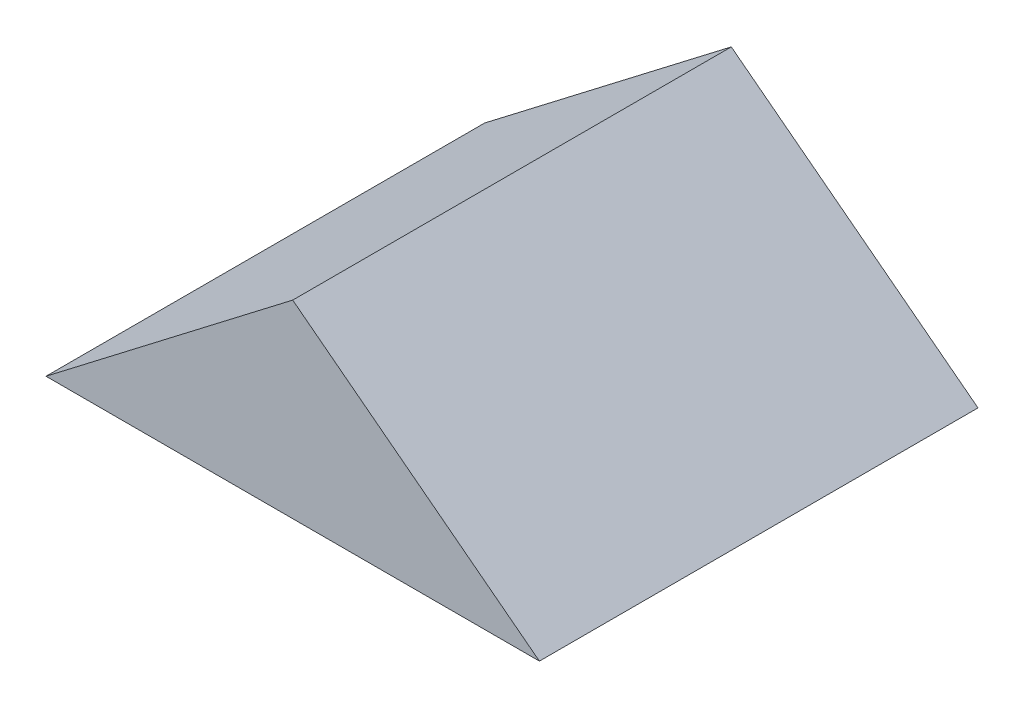
ISO-10303-21;
HEADER;
FILE_DESCRIPTION(('STEP AP214'),'2;1');
FILE_NAME('part.step','',(''),(''),'','','');
FILE_SCHEMA(('AUTOMOTIVE_DESIGN { 1 0 10303 214 1 1 1 1 }'));
ENDSEC;
DATA;
#1=APPLICATION_CONTEXT('core data for automotive mechanical design processes');
#2=APPLICATION_PROTOCOL_DEFINITION('international standard','automotive_design',2000,#1);
#3=PRODUCT_CONTEXT('',#1,'mechanical');
#4=PRODUCT('Part','Part','',(#3));
#5=PRODUCT_RELATED_PRODUCT_CATEGORY('part','',(#4));
#6=PRODUCT_DEFINITION_FORMATION('','',#4);
#7=PRODUCT_DEFINITION_CONTEXT('part definition',#1,'design');
#8=PRODUCT_DEFINITION('design','',#6,#7);
#9=PRODUCT_DEFINITION_SHAPE('','',#8);
#10=(LENGTH_UNIT() NAMED_UNIT(*) SI_UNIT(.MILLI.,.METRE.));
#11=(NAMED_UNIT(*) PLANE_ANGLE_UNIT() SI_UNIT($,.RADIAN.));
#12=(NAMED_UNIT(*) SI_UNIT($,.STERADIAN.) SOLID_ANGLE_UNIT());
#13=UNCERTAINTY_MEASURE_WITH_UNIT(LENGTH_MEASURE(1.E-05),#10,'distance_accuracy_value','');
#14=(GEOMETRIC_REPRESENTATION_CONTEXT(3) GLOBAL_UNCERTAINTY_ASSIGNED_CONTEXT((#13)) GLOBAL_UNIT_ASSIGNED_CONTEXT((#10,
#11,#12)) REPRESENTATION_CONTEXT('',''));
#15=CARTESIAN_POINT('',(0.,0.,0.));
#16=DIRECTION('',(0.,0.,1.));
#17=DIRECTION('',(1.,0.,0.));
#18=AXIS2_PLACEMENT_3D('',#15,#16,#17);
#19=CARTESIAN_POINT('',(0.,-2.67326987978964,0.));
#20=DIRECTION('',(0.,-1.,0.));
#21=DIRECTION('',(1.,0.,0.));
#22=AXIS2_PLACEMENT_3D('',#19,#20,#21);
#23=PLANE('',#22);
#24=DIRECTION('',(-1.,0.,0.));
#25=VECTOR('',#24,1.);
#26=CARTESIAN_POINT('',(80.,-2.67326987978962,150.));
#27=LINE('',#26,#25);
#28=CARTESIAN_POINT('',(80.,-2.67326987978962,150.));
#29=VERTEX_POINT('',#28);
#30=CARTESIAN_POINT('',(71.1637758980097,-2.67326987978962,150.));
#31=VERTEX_POINT('',#30);
#32=EDGE_CURVE('E171',#29,#31,#27,.T.);
#33=ORIENTED_EDGE('',*,*,#32,.T.);
#34=DIRECTION('',(0.,0.,1.));
#35=VECTOR('',#34,1.);
#36=CARTESIAN_POINT('',(71.1637758980097,-2.67326987978962,160.));
#37=LINE('',#36,#35);
#38=CARTESIAN_POINT('',(71.1637758980097,-2.67326987978962,10.));
#39=VERTEX_POINT('',#38);
#40=EDGE_CURVE('E11',#31,#39,#37,.F.);
#41=ORIENTED_EDGE('',*,*,#40,.T.);
#42=DIRECTION('',(1.,0.,0.));
#43=VECTOR('',#42,1.);
#44=CARTESIAN_POINT('',(-80.,-2.67326987978965,10.));
#45=LINE('',#44,#43);
#46=CARTESIAN_POINT('',(80.,-2.67326987978962,10.));
#47=VERTEX_POINT('',#46);
#48=EDGE_CURVE('E161',#39,#47,#45,.T.);
#49=ORIENTED_EDGE('',*,*,#48,.T.);
#50=DIRECTION('',(0.,0.,1.));
#51=VECTOR('',#50,1.);
#52=CARTESIAN_POINT('',(80.,-2.67326987978962,10.));
#53=LINE('',#52,#51);
#54=EDGE_CURVE('E166',#47,#29,#53,.T.);
#55=ORIENTED_EDGE('',*,*,#54,.T.);
#56=EDGE_LOOP('',(#33,#41,#49,#55));
#57=FACE_BOUND('',#56,.T.);
#58=ADVANCED_FACE('F33',(#57),#23,.T.);
#59=CARTESIAN_POINT('',(-80.,-2.67326987978965,10.));
#60=VERTEX_POINT('',#59);
#61=CARTESIAN_POINT('',(-71.1637758980097,-2.67326987978965,10.));
#62=VERTEX_POINT('',#61);
#63=EDGE_CURVE('E163',#60,#62,#45,.T.);
#64=ORIENTED_EDGE('',*,*,#63,.T.);
#65=DIRECTION('',(0.,0.,-1.));
#66=VECTOR('',#65,1.);
#67=CARTESIAN_POINT('',(-71.1637758980097,-2.67326987978965,160.));
#68=LINE('',#67,#66);
#69=CARTESIAN_POINT('',(-71.1637758980097,-2.67326987978965,150.));
#70=VERTEX_POINT('',#69);
#71=EDGE_CURVE('E42',#62,#70,#68,.F.);
#72=ORIENTED_EDGE('',*,*,#71,.T.);
#73=CARTESIAN_POINT('',(-80.,-2.67326987978965,150.));
#74=VERTEX_POINT('',#73);
#75=EDGE_CURVE('E170',#70,#74,#27,.T.);
#76=ORIENTED_EDGE('',*,*,#75,.T.);
#77=DIRECTION('',(0.,0.,-1.));
#78=VECTOR('',#77,1.);
#79=CARTESIAN_POINT('',(-80.,-2.67326987978965,150.));
#80=LINE('',#79,#78);
#81=EDGE_CURVE('E158',#74,#60,#80,.T.);
#82=ORIENTED_EDGE('',*,*,#81,.T.);
#83=EDGE_LOOP('',(#64,#72,#76,#82));
#84=FACE_BOUND('',#83,.T.);
#85=ADVANCED_FACE('F238',(#84),#23,.T.);
#86=CARTESIAN_POINT('',(80.,0.,160.));
#87=DIRECTION('',(-0.608761429008722,-0.793353340291234,0.));
#88=DIRECTION('',(0.793353340291234,-0.608761429008722,0.));
#89=AXIS2_PLACEMENT_3D('',#86,#87,#88);
#90=PLANE('',#89);
#91=DIRECTION('',(-0.793353340291234,0.608761429008722,0.));
#92=VECTOR('',#91,1.);
#93=CARTESIAN_POINT('',(80.,0.,0.));
#94=LINE('',#93,#92);
#95=CARTESIAN_POINT('',(90.,-7.67326987978962,0.));
#96=VERTEX_POINT('',#95);
#97=CARTESIAN_POINT('',(0.,61.3861590383171,0.));
#98=VERTEX_POINT('',#97);
#99=EDGE_CURVE('E197',#96,#98,#94,.T.);
#100=ORIENTED_EDGE('',*,*,#99,.T.);
#101=DIRECTION('',(0.,0.,-1.));
#102=VECTOR('',#101,1.);
#103=CARTESIAN_POINT('',(0.,61.3861590383171,160.));
#104=LINE('',#103,#102);
#105=CARTESIAN_POINT('',(0.,61.3861590383171,160.));
#106=VERTEX_POINT('',#105);
#107=EDGE_CURVE('E207',#106,#98,#104,.T.);
#108=ORIENTED_EDGE('',*,*,#107,.F.);
#109=DIRECTION('',(0.793353340291234,-0.608761429008723,0.));
#110=VECTOR('',#109,1.);
#111=CARTESIAN_POINT('',(80.,0.,160.));
#112=LINE('',#111,#110);
#113=CARTESIAN_POINT('',(90.,-7.67326987978962,160.));
#114=VERTEX_POINT('',#113);
#115=EDGE_CURVE('E193',#106,#114,#112,.T.);
#116=ORIENTED_EDGE('',*,*,#115,.T.);
#117=DIRECTION('',(0.,0.,-1.));
#118=VECTOR('',#117,1.);
#119=CARTESIAN_POINT('',(90.,-7.67326987978962,160.));
#120=LINE('',#119,#118);
#121=EDGE_CURVE('E37',#114,#96,#120,.T.);
#122=ORIENTED_EDGE('',*,*,#121,.T.);
#123=EDGE_LOOP('',(#100,#108,#116,#122));
#124=FACE_BOUND('',#123,.T.);
#125=ADVANCED_FACE('F215',(#124),#90,.F.);
#126=CARTESIAN_POINT('',(0.,61.3861590383171,160.));
#127=DIRECTION('',(0.608761429008723,-0.793353340291234,0.));
#128=DIRECTION('',(0.793353340291234,0.608761429008723,0.));
#129=AXIS2_PLACEMENT_3D('',#126,#127,#128);
#130=PLANE('',#129);
#131=DIRECTION('',(-0.793353340291234,-0.608761429008722,0.));
#132=VECTOR('',#131,1.);
#133=CARTESIAN_POINT('',(0.,61.3861590383171,0.));
#134=LINE('',#133,#132);
#135=CARTESIAN_POINT('',(-90.,-7.67326987978965,0.));
#136=VERTEX_POINT('',#135);
#137=EDGE_CURVE('E204',#98,#136,#134,.T.);
#138=ORIENTED_EDGE('',*,*,#137,.T.);
#139=DIRECTION('',(0.,0.,-1.));
#140=VECTOR('',#139,1.);
#141=CARTESIAN_POINT('',(-90.,-7.67326987978965,160.));
#142=LINE('',#141,#140);
#143=CARTESIAN_POINT('',(-90.,-7.67326987978965,160.));
#144=VERTEX_POINT('',#143);
#145=EDGE_CURVE('E209',#144,#136,#142,.T.);
#146=ORIENTED_EDGE('',*,*,#145,.F.);
#147=DIRECTION('',(0.793353340291234,0.608761429008723,0.));
#148=VECTOR('',#147,1.);
#149=CARTESIAN_POINT('',(-90.,-7.67326987978965,160.));
#150=LINE('',#149,#148);
#151=EDGE_CURVE('E200',#144,#106,#150,.T.);
#152=ORIENTED_EDGE('',*,*,#151,.T.);
#153=ORIENTED_EDGE('',*,*,#107,.T.);
#154=EDGE_LOOP('',(#138,#146,#152,#153));
#155=FACE_BOUND('',#154,.T.);
#156=ADVANCED_FACE('F223',(#155),#130,.F.);
#157=CARTESIAN_POINT('',(90.,-7.67326987978962,160.));
#158=DIRECTION('',(0.,-1.,0.));
#159=DIRECTION('',(1.,0.,0.));
#160=AXIS2_PLACEMENT_3D('',#157,#158,#159);
#161=PLANE('',#160);
#162=DIRECTION('',(0.,0.,-1.));
#163=VECTOR('',#162,1.);
#164=CARTESIAN_POINT('',(-80.,-7.67326987978965,150.));
#165=LINE('',#164,#163);
#166=CARTESIAN_POINT('',(-80.,-7.67326987978965,150.));
#167=VERTEX_POINT('',#166);
#168=CARTESIAN_POINT('',(-80.,-7.67326987978965,10.));
#169=VERTEX_POINT('',#168);
#170=EDGE_CURVE('E60',#167,#169,#165,.T.);
#171=ORIENTED_EDGE('',*,*,#170,.F.);
#172=DIRECTION('',(-1.,0.,0.));
#173=VECTOR('',#172,1.);
#174=CARTESIAN_POINT('',(80.,-7.67326987978962,150.));
#175=LINE('',#174,#173);
#176=CARTESIAN_POINT('',(80.,-7.67326987978962,150.));
#177=VERTEX_POINT('',#176);
#178=EDGE_CURVE('E162',#177,#167,#175,.T.);
#179=ORIENTED_EDGE('',*,*,#178,.F.);
#180=DIRECTION('',(0.,0.,1.));
#181=VECTOR('',#180,1.);
#182=CARTESIAN_POINT('',(80.,-7.67326987978962,10.));
#183=LINE('',#182,#181);
#184=CARTESIAN_POINT('',(80.,-7.67326987978962,10.));
#185=VERTEX_POINT('',#184);
#186=EDGE_CURVE('E180',#185,#177,#183,.T.);
#187=ORIENTED_EDGE('',*,*,#186,.F.);
#188=DIRECTION('',(1.,0.,0.));
#189=VECTOR('',#188,1.);
#190=CARTESIAN_POINT('',(-80.,-7.67326987978965,10.));
#191=LINE('',#190,#189);
#192=EDGE_CURVE('E177',#169,#185,#191,.T.);
#193=ORIENTED_EDGE('',*,*,#192,.F.);
#194=EDGE_LOOP('',(#171,#179,#187,#193));
#195=FACE_BOUND('',#194,.T.);
#196=DIRECTION('',(-1.,0.,0.));
#197=VECTOR('',#196,1.);
#198=CARTESIAN_POINT('',(90.,-7.67326987978962,0.));
#199=LINE('',#198,#197);
#200=EDGE_CURVE('E187',#96,#136,#199,.T.);
#201=ORIENTED_EDGE('',*,*,#200,.F.);
#202=ORIENTED_EDGE('',*,*,#121,.F.);
#203=DIRECTION('',(-1.,0.,0.));
#204=VECTOR('',#203,1.);
#205=CARTESIAN_POINT('',(90.,-7.67326987978962,160.));
#206=LINE('',#205,#204);
#207=EDGE_CURVE('E196',#114,#144,#206,.T.);
#208=ORIENTED_EDGE('',*,*,#207,.T.);
#209=ORIENTED_EDGE('',*,*,#145,.T.);
#210=EDGE_LOOP('',(#201,#202,#208,#209));
#211=FACE_BOUND('',#210,.T.);
#212=ADVANCED_FACE('F35',(#195,#211),#161,.T.);
#213=CARTESIAN_POINT('',(0.,0.,160.));
#214=DIRECTION('',(0.,0.,1.));
#215=DIRECTION('',(1.,0.,0.));
#216=AXIS2_PLACEMENT_3D('',#213,#214,#215);
#217=PLANE('',#216);
#218=ORIENTED_EDGE('',*,*,#115,.F.);
#219=ORIENTED_EDGE('',*,*,#151,.F.);
#220=ORIENTED_EDGE('',*,*,#207,.F.);
#221=EDGE_LOOP('',(#218,#219,#220));
#222=FACE_BOUND('',#221,.T.);
#223=ADVANCED_FACE('F226',(#222),#217,.T.);
#224=CARTESIAN_POINT('',(0.,0.,0.));
#225=DIRECTION('',(0.,0.,1.));
#226=DIRECTION('',(1.,0.,0.));
#227=AXIS2_PLACEMENT_3D('',#224,#225,#226);
#228=PLANE('',#227);
#229=ORIENTED_EDGE('',*,*,#99,.F.);
#230=ORIENTED_EDGE('',*,*,#200,.T.);
#231=ORIENTED_EDGE('',*,*,#137,.F.);
#232=EDGE_LOOP('',(#229,#230,#231));
#233=FACE_BOUND('',#232,.T.);
#234=ADVANCED_FACE('F221',(#233),#228,.F.);
#235=CARTESIAN_POINT('',(-80.,-2.67326987978965,150.));
#236=DIRECTION('',(-1.,0.,0.));
#237=DIRECTION('',(0.,-1.,0.));
#238=AXIS2_PLACEMENT_3D('',#235,#236,#237);
#239=PLANE('',#238);
#240=ORIENTED_EDGE('',*,*,#170,.T.);
#241=DIRECTION('',(0.,-1.,0.));
#242=VECTOR('',#241,1.);
#243=CARTESIAN_POINT('',(-80.,-2.67326987978965,10.));
#244=LINE('',#243,#242);
#245=EDGE_CURVE('E174',#60,#169,#244,.T.);
#246=ORIENTED_EDGE('',*,*,#245,.F.);
#247=ORIENTED_EDGE('',*,*,#81,.F.);
#248=DIRECTION('',(0.,-1.,0.));
#249=VECTOR('',#248,1.);
#250=CARTESIAN_POINT('',(-80.,-2.67326987978965,150.));
#251=LINE('',#250,#249);
#252=EDGE_CURVE('E185',#74,#167,#251,.T.);
#253=ORIENTED_EDGE('',*,*,#252,.T.);
#254=EDGE_LOOP('',(#240,#246,#247,#253));
#255=FACE_BOUND('',#254,.T.);
#256=ADVANCED_FACE('F233',(#255),#239,.F.);
#257=CARTESIAN_POINT('',(80.,-2.67326987978962,150.));
#258=DIRECTION('',(0.,0.,1.));
#259=DIRECTION('',(1.,0.,0.));
#260=AXIS2_PLACEMENT_3D('',#257,#258,#259);
#261=PLANE('',#260);
#262=ORIENTED_EDGE('',*,*,#178,.T.);
#263=ORIENTED_EDGE('',*,*,#252,.F.);
#264=ORIENTED_EDGE('',*,*,#75,.F.);
#265=EDGE_CURVE('E175',#31,#70,#27,.T.);
#266=ORIENTED_EDGE('',*,*,#265,.F.);
#267=ORIENTED_EDGE('',*,*,#32,.F.);
#268=DIRECTION('',(0.,-1.,0.));
#269=VECTOR('',#268,1.);
#270=CARTESIAN_POINT('',(80.,-2.67326987978962,150.));
#271=LINE('',#270,#269);
#272=EDGE_CURVE('E188',#29,#177,#271,.T.);
#273=ORIENTED_EDGE('',*,*,#272,.T.);
#274=EDGE_LOOP('',(#262,#263,#264,#266,#267,#273));
#275=FACE_BOUND('',#274,.T.);
#276=ADVANCED_FACE('F248',(#275),#261,.F.);
#277=CARTESIAN_POINT('',(80.,-2.67326987978962,10.));
#278=DIRECTION('',(1.,0.,0.));
#279=DIRECTION('',(0.,1.,0.));
#280=AXIS2_PLACEMENT_3D('',#277,#278,#279);
#281=PLANE('',#280);
#282=ORIENTED_EDGE('',*,*,#186,.T.);
#283=ORIENTED_EDGE('',*,*,#272,.F.);
#284=ORIENTED_EDGE('',*,*,#54,.F.);
#285=DIRECTION('',(0.,-1.,0.));
#286=VECTOR('',#285,1.);
#287=CARTESIAN_POINT('',(80.,-2.67326987978962,10.));
#288=LINE('',#287,#286);
#289=EDGE_CURVE('E190',#47,#185,#288,.T.);
#290=ORIENTED_EDGE('',*,*,#289,.T.);
#291=EDGE_LOOP('',(#282,#283,#284,#290));
#292=FACE_BOUND('',#291,.T.);
#293=ADVANCED_FACE('F251',(#292),#281,.F.);
#294=CARTESIAN_POINT('',(-80.,-2.67326987978965,10.));
#295=DIRECTION('',(0.,0.,-1.));
#296=DIRECTION('',(-1.,0.,0.));
#297=AXIS2_PLACEMENT_3D('',#294,#295,#296);
#298=PLANE('',#297);
#299=ORIENTED_EDGE('',*,*,#192,.T.);
#300=ORIENTED_EDGE('',*,*,#289,.F.);
#301=ORIENTED_EDGE('',*,*,#48,.F.);
#302=EDGE_CURVE('E167',#62,#39,#45,.T.);
#303=ORIENTED_EDGE('',*,*,#302,.F.);
#304=ORIENTED_EDGE('',*,*,#63,.F.);
#305=ORIENTED_EDGE('',*,*,#245,.T.);
#306=EDGE_LOOP('',(#299,#300,#301,#303,#304,#305));
#307=FACE_BOUND('',#306,.T.);
#308=ADVANCED_FACE('F255',(#307),#298,.F.);
#309=CARTESIAN_POINT('',(0.,-2.67326987978964,0.));
#310=DIRECTION('',(0.,-1.,0.));
#311=DIRECTION('',(1.,0.,0.));
#312=AXIS2_PLACEMENT_3D('',#309,#310,#311);
#313=PLANE('',#312);
#314=ORIENTED_EDGE('',*,*,#302,.T.);
#315=CARTESIAN_POINT('',(71.1637758980097,-2.67326987978962,7.50000000000001));
#316=VERTEX_POINT('',#315);
#317=EDGE_CURVE('E45',#39,#316,#37,.F.);
#318=ORIENTED_EDGE('',*,*,#317,.T.);
#319=DIRECTION('',(1.,0.,0.));
#320=VECTOR('',#319,1.);
#321=CARTESIAN_POINT('',(0.,-2.67326987978964,7.5));
#322=LINE('',#321,#320);
#323=CARTESIAN_POINT('',(-71.1637758980097,-2.67326987978965,7.5));
#324=VERTEX_POINT('',#323);
#325=EDGE_CURVE('E133',#316,#324,#322,.F.);
#326=ORIENTED_EDGE('',*,*,#325,.T.);
#327=EDGE_CURVE('E147',#324,#62,#68,.F.);
#328=ORIENTED_EDGE('',*,*,#327,.T.);
#329=EDGE_LOOP('',(#314,#318,#326,#328));
#330=FACE_BOUND('',#329,.T.);
#331=ADVANCED_FACE('F258',(#330),#313,.F.);
#332=CARTESIAN_POINT('',(75.4342892824346,-5.95015005218423,160.));
#333=DIRECTION('',(-0.608761429008722,-0.793353340291234,0.));
#334=DIRECTION('',(0.793353340291234,-0.608761429008722,0.));
#335=AXIS2_PLACEMENT_3D('',#332,#333,#334);
#336=PLANE('',#335);
#337=DIRECTION('',(-0.793353340291234,0.608761429008722,0.));
#338=VECTOR('',#337,1.);
#339=CARTESIAN_POINT('',(75.4342892824346,-5.95015005218423,7.50000000000001));
#340=LINE('',#339,#338);
#341=CARTESIAN_POINT('',(0.,51.9326159332401,7.5));
#342=VERTEX_POINT('',#341);
#343=EDGE_CURVE('E126',#316,#342,#340,.T.);
#344=ORIENTED_EDGE('',*,*,#343,.F.);
#345=ORIENTED_EDGE('',*,*,#317,.F.);
#346=ORIENTED_EDGE('',*,*,#40,.F.);
#347=CARTESIAN_POINT('',(71.1637758980097,-2.67326987978962,152.5));
#348=VERTEX_POINT('',#347);
#349=EDGE_CURVE('E44',#348,#31,#37,.F.);
#350=ORIENTED_EDGE('',*,*,#349,.F.);
#351=DIRECTION('',(0.793353340291234,-0.608761429008722,0.));
#352=VECTOR('',#351,1.);
#353=CARTESIAN_POINT('',(25.0815274783339,32.6868829993785,152.5));
#354=LINE('',#353,#352);
#355=CARTESIAN_POINT('',(0.,51.9326159332401,152.5));
#356=VERTEX_POINT('',#355);
#357=EDGE_CURVE('E136',#356,#348,#354,.T.);
#358=ORIENTED_EDGE('',*,*,#357,.F.);
#359=DIRECTION('',(0.,0.,-1.));
#360=VECTOR('',#359,1.);
#361=CARTESIAN_POINT('',(0.,51.9326159332401,160.));
#362=LINE('',#361,#360);
#363=EDGE_CURVE('E140',#356,#342,#362,.T.);
#364=ORIENTED_EDGE('',*,*,#363,.T.);
#365=EDGE_LOOP('',(#344,#345,#346,#350,#358,#364));
#366=FACE_BOUND('',#365,.T.);
#367=ADVANCED_FACE('F141',(#366),#336,.T.);
#368=CARTESIAN_POINT('',(4.56571071756542,55.4360089861329,160.));
#369=DIRECTION('',(0.608761429008723,-0.793353340291234,0.));
#370=DIRECTION('',(0.793353340291234,0.608761429008723,0.));
#371=AXIS2_PLACEMENT_3D('',#368,#369,#370);
#372=PLANE('',#371);
#373=DIRECTION('',(-0.793353340291234,-0.608761429008723,0.));
#374=VECTOR('',#373,1.);
#375=CARTESIAN_POINT('',(4.56571071756542,55.4360089861329,7.50000000000001));
#376=LINE('',#375,#374);
#377=EDGE_CURVE('E130',#342,#324,#376,.T.);
#378=ORIENTED_EDGE('',*,*,#377,.F.);
#379=ORIENTED_EDGE('',*,*,#363,.F.);
#380=DIRECTION('',(0.793353340291234,0.608761429008723,0.));
#381=VECTOR('',#380,1.);
#382=CARTESIAN_POINT('',(-25.0815274783339,32.6868829993785,152.5));
#383=LINE('',#382,#381);
#384=CARTESIAN_POINT('',(-71.1637758980097,-2.67326987978965,152.5));
#385=VERTEX_POINT('',#384);
#386=EDGE_CURVE('E143',#385,#356,#383,.T.);
#387=ORIENTED_EDGE('',*,*,#386,.F.);
#388=EDGE_CURVE('E52',#70,#385,#68,.F.);
#389=ORIENTED_EDGE('',*,*,#388,.F.);
#390=ORIENTED_EDGE('',*,*,#71,.F.);
#391=ORIENTED_EDGE('',*,*,#327,.F.);
#392=EDGE_LOOP('',(#378,#379,#387,#389,#390,#391));
#393=FACE_BOUND('',#392,.T.);
#394=ADVANCED_FACE('F145',(#393),#372,.T.);
#395=CARTESIAN_POINT('',(0.,0.,152.5));
#396=DIRECTION('',(0.,0.,1.));
#397=DIRECTION('',(1.,0.,0.));
#398=AXIS2_PLACEMENT_3D('',#395,#396,#397);
#399=PLANE('',#398);
#400=ORIENTED_EDGE('',*,*,#357,.T.);
#401=DIRECTION('',(1.,0.,0.));
#402=VECTOR('',#401,1.);
#403=CARTESIAN_POINT('',(0.,-2.67326987978964,152.5));
#404=LINE('',#403,#402);
#405=EDGE_CURVE('E154',#385,#348,#404,.T.);
#406=ORIENTED_EDGE('',*,*,#405,.F.);
#407=ORIENTED_EDGE('',*,*,#386,.T.);
#408=EDGE_LOOP('',(#400,#406,#407));
#409=FACE_BOUND('',#408,.T.);
#410=ADVANCED_FACE('F299',(#409),#399,.F.);
#411=CARTESIAN_POINT('',(0.,0.,7.5));
#412=DIRECTION('',(0.,0.,1.));
#413=DIRECTION('',(1.,0.,0.));
#414=AXIS2_PLACEMENT_3D('',#411,#412,#413);
#415=PLANE('',#414);
#416=ORIENTED_EDGE('',*,*,#343,.T.);
#417=ORIENTED_EDGE('',*,*,#377,.T.);
#418=ORIENTED_EDGE('',*,*,#325,.F.);
#419=EDGE_LOOP('',(#416,#417,#418));
#420=FACE_BOUND('',#419,.T.);
#421=ADVANCED_FACE('F128',(#420),#415,.T.);
#422=ORIENTED_EDGE('',*,*,#265,.T.);
#423=ORIENTED_EDGE('',*,*,#388,.T.);
#424=ORIENTED_EDGE('',*,*,#405,.T.);
#425=ORIENTED_EDGE('',*,*,#349,.T.);
#426=EDGE_LOOP('',(#422,#423,#424,#425));
#427=FACE_BOUND('',#426,.T.);
#428=ADVANCED_FACE('F287',(#427),#313,.F.);
#429=CLOSED_SHELL('',(#58,#85,#125,#156,#212,#223,#234,#256,#276,#293,#308,#331,#367,#394,#410,
#421,#428));
#430=MANIFOLD_SOLID_BREP('B2',#429);
#431=ADVANCED_BREP_SHAPE_REPRESENTATION('',(#18,#430),#14);
#432=SHAPE_DEFINITION_REPRESENTATION(#9,#431);
ENDSEC;
END-ISO-10303-21;
